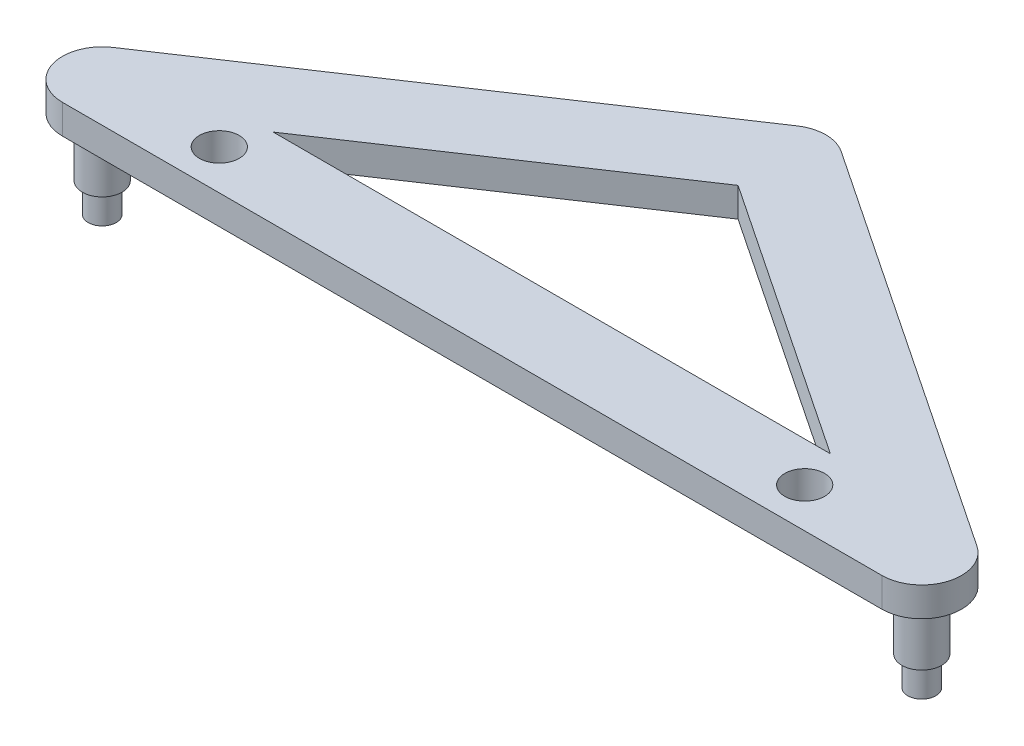
ISO-10303-21;
HEADER;
FILE_DESCRIPTION(('STEP AP214'),'2;1');
FILE_NAME('part.step','',(''),(''),'','','');
FILE_SCHEMA(('AUTOMOTIVE_DESIGN { 1 0 10303 214 1 1 1 1 }'));
ENDSEC;
DATA;
#1=APPLICATION_CONTEXT('core data for automotive mechanical design processes');
#2=APPLICATION_PROTOCOL_DEFINITION('international standard','automotive_design',2000,#1);
#3=PRODUCT_CONTEXT('',#1,'mechanical');
#4=PRODUCT('Part','Part','',(#3));
#5=PRODUCT_RELATED_PRODUCT_CATEGORY('part','',(#4));
#6=PRODUCT_DEFINITION_FORMATION('','',#4);
#7=PRODUCT_DEFINITION_CONTEXT('part definition',#1,'design');
#8=PRODUCT_DEFINITION('design','',#6,#7);
#9=PRODUCT_DEFINITION_SHAPE('','',#8);
#10=(LENGTH_UNIT() NAMED_UNIT(*) SI_UNIT(.MILLI.,.METRE.));
#11=(NAMED_UNIT(*) PLANE_ANGLE_UNIT() SI_UNIT($,.RADIAN.));
#12=(NAMED_UNIT(*) SI_UNIT($,.STERADIAN.) SOLID_ANGLE_UNIT());
#13=UNCERTAINTY_MEASURE_WITH_UNIT(LENGTH_MEASURE(1.E-05),#10,'distance_accuracy_value','');
#14=(GEOMETRIC_REPRESENTATION_CONTEXT(3) GLOBAL_UNCERTAINTY_ASSIGNED_CONTEXT((#13)) GLOBAL_UNIT_ASSIGNED_CONTEXT((#10,
#11,#12)) REPRESENTATION_CONTEXT('',''));
#15=CARTESIAN_POINT('',(0.,0.,0.));
#16=DIRECTION('',(0.,0.,1.));
#17=DIRECTION('',(1.,0.,0.));
#18=AXIS2_PLACEMENT_3D('',#15,#16,#17);
#19=CARTESIAN_POINT('',(0.,5.,0.));
#20=DIRECTION('',(0.,-1.,0.));
#21=DIRECTION('',(0.,0.,-1.));
#22=AXIS2_PLACEMENT_3D('',#19,#20,#21);
#23=CYLINDRICAL_SURFACE('',#22,1.7);
#24=CARTESIAN_POINT('',(0.,5.,0.));
#25=DIRECTION('',(0.,1.,0.));
#26=DIRECTION('',(0.,0.,1.));
#27=AXIS2_PLACEMENT_3D('',#24,#25,#26);
#28=CIRCLE('',#27,1.7);
#29=CARTESIAN_POINT('',(0.,5.,1.7));
#30=VERTEX_POINT('',#29);
#31=EDGE_CURVE('E189',#30,#30,#28,.T.);
#32=ORIENTED_EDGE('',*,*,#31,.F.);
#33=EDGE_LOOP('',(#32));
#34=FACE_BOUND('',#33,.T.);
#35=CARTESIAN_POINT('',(0.,0.,0.));
#36=DIRECTION('',(0.,1.,0.));
#37=DIRECTION('',(0.,0.,1.));
#38=AXIS2_PLACEMENT_3D('',#35,#36,#37);
#39=CIRCLE('',#38,1.7);
#40=CARTESIAN_POINT('',(0.,0.,1.7));
#41=VERTEX_POINT('',#40);
#42=EDGE_CURVE('E126',#41,#41,#39,.T.);
#43=ORIENTED_EDGE('',*,*,#42,.T.);
#44=EDGE_LOOP('',(#43));
#45=FACE_BOUND('',#44,.T.);
#46=ADVANCED_FACE('F39',(#34,#45),#23,.T.);
#47=CARTESIAN_POINT('',(0.,0.,0.));
#48=DIRECTION('',(0.,1.,0.));
#49=DIRECTION('',(0.,0.,1.));
#50=AXIS2_PLACEMENT_3D('',#47,#48,#49);
#51=PLANE('',#50);
#52=CARTESIAN_POINT('',(0.,0.,0.));
#53=DIRECTION('',(0.,-1.,0.));
#54=DIRECTION('',(0.,0.,-1.));
#55=AXIS2_PLACEMENT_3D('',#52,#53,#54);
#56=CIRCLE('',#55,1.2);
#57=CARTESIAN_POINT('',(0.,0.,-1.2));
#58=VERTEX_POINT('',#57);
#59=EDGE_CURVE('E195',#58,#58,#56,.T.);
#60=ORIENTED_EDGE('',*,*,#59,.F.);
#61=EDGE_LOOP('',(#60));
#62=FACE_BOUND('',#61,.T.);
#63=ORIENTED_EDGE('',*,*,#42,.F.);
#64=EDGE_LOOP('',(#63));
#65=FACE_BOUND('',#64,.T.);
#66=ADVANCED_FACE('F260',(#62,#65),#51,.F.);
#67=CARTESIAN_POINT('',(19.7339341229814,7.5,-29.5165681326645));
#68=DIRECTION('',(-0.55579595927859,0.,0.831318742510712));
#69=DIRECTION('',(0.831318742510712,0.,0.55579595927859));
#70=AXIS2_PLACEMENT_3D('',#67,#68,#69);
#71=PLANE('',#70);
#72=DIRECTION('',(-0.831318742510712,0.,-0.55579595927859));
#73=VECTOR('',#72,1.);
#74=CARTESIAN_POINT('',(19.7339341229814,5.,-29.5165681326645));
#75=LINE('',#74,#73);
#76=CARTESIAN_POINT('',(58.7971770564539,5.,-3.4));
#77=VERTEX_POINT('',#76);
#78=CARTESIAN_POINT('',(35.,5.,-19.3101126606006));
#79=VERTEX_POINT('',#78);
#80=EDGE_CURVE('E121',#77,#79,#75,.T.);
#81=ORIENTED_EDGE('',*,*,#80,.F.);
#82=DIRECTION('',(0.,-1.,0.));
#83=VECTOR('',#82,1.);
#84=CARTESIAN_POINT('',(58.7971770564539,7.5,-3.4));
#85=LINE('',#84,#83);
#86=CARTESIAN_POINT('',(58.7971770564539,7.5,-3.4));
#87=VERTEX_POINT('',#86);
#88=EDGE_CURVE('E117',#87,#77,#85,.T.);
#89=ORIENTED_EDGE('',*,*,#88,.F.);
#90=DIRECTION('',(-0.831318742510712,0.,-0.55579595927859));
#91=VECTOR('',#90,1.);
#92=CARTESIAN_POINT('',(19.7339341229814,7.5,-29.5165681326645));
#93=LINE('',#92,#91);
#94=CARTESIAN_POINT('',(35.,7.5,-19.3101126606006));
#95=VERTEX_POINT('',#94);
#96=EDGE_CURVE('E119',#87,#95,#93,.T.);
#97=ORIENTED_EDGE('',*,*,#96,.T.);
#98=DIRECTION('',(0.,-1.,0.));
#99=VECTOR('',#98,1.);
#100=CARTESIAN_POINT('',(35.,7.5,-19.3101126606006));
#101=LINE('',#100,#99);
#102=EDGE_CURVE('E93',#95,#79,#101,.T.);
#103=ORIENTED_EDGE('',*,*,#102,.T.);
#104=EDGE_LOOP('',(#81,#89,#97,#103));
#105=FACE_BOUND('',#104,.T.);
#106=ADVANCED_FACE('F118',(#105),#71,.T.);
#107=CARTESIAN_POINT('',(0.,7.5,-3.4));
#108=DIRECTION('',(0.,0.,-1.));
#109=DIRECTION('',(-1.,0.,0.));
#110=AXIS2_PLACEMENT_3D('',#107,#108,#109);
#111=PLANE('',#110);
#112=DIRECTION('',(1.,0.,0.));
#113=VECTOR('',#112,1.);
#114=CARTESIAN_POINT('',(0.,5.,-3.4));
#115=LINE('',#114,#113);
#116=CARTESIAN_POINT('',(11.2028229435461,5.,-3.4));
#117=VERTEX_POINT('',#116);
#118=EDGE_CURVE('E162',#117,#77,#115,.T.);
#119=ORIENTED_EDGE('',*,*,#118,.F.);
#120=DIRECTION('',(0.,-1.,0.));
#121=VECTOR('',#120,1.);
#122=CARTESIAN_POINT('',(11.2028229435461,7.5,-3.4));
#123=LINE('',#122,#121);
#124=CARTESIAN_POINT('',(11.2028229435461,7.5,-3.4));
#125=VERTEX_POINT('',#124);
#126=EDGE_CURVE('E86',#125,#117,#123,.T.);
#127=ORIENTED_EDGE('',*,*,#126,.F.);
#128=DIRECTION('',(1.,0.,0.));
#129=VECTOR('',#128,1.);
#130=CARTESIAN_POINT('',(0.,7.5,-3.4));
#131=LINE('',#130,#129);
#132=EDGE_CURVE('E130',#125,#87,#131,.T.);
#133=ORIENTED_EDGE('',*,*,#132,.T.);
#134=ORIENTED_EDGE('',*,*,#88,.T.);
#135=EDGE_LOOP('',(#119,#127,#133,#134));
#136=FACE_BOUND('',#135,.T.);
#137=ADVANCED_FACE('F133',(#136),#111,.T.);
#138=CARTESIAN_POINT('',(70.,7.5,0.));
#139=DIRECTION('',(0.,-1.,0.));
#140=DIRECTION('',(0.,0.,-1.));
#141=AXIS2_PLACEMENT_3D('',#138,#139,#140);
#142=CYLINDRICAL_SURFACE('',#141,3.4);
#143=CARTESIAN_POINT('',(70.,5.,0.));
#144=DIRECTION('',(0.,1.,0.));
#145=DIRECTION('',(0.,0.,1.));
#146=AXIS2_PLACEMENT_3D('',#143,#144,#145);
#147=CIRCLE('',#146,3.4);
#148=CARTESIAN_POINT('',(70.,5.,3.4));
#149=VERTEX_POINT('',#148);
#150=CARTESIAN_POINT('',(71.8897062615472,5.,-2.82648372453642));
#151=VERTEX_POINT('',#150);
#152=EDGE_CURVE('E145',#149,#151,#147,.T.);
#153=ORIENTED_EDGE('',*,*,#152,.T.);
#154=DIRECTION('',(0.,-1.,0.));
#155=VECTOR('',#154,1.);
#156=CARTESIAN_POINT('',(71.8897062615472,7.5,-2.82648372453642));
#157=LINE('',#156,#155);
#158=CARTESIAN_POINT('',(71.8897062615472,7.5,-2.82648372453642));
#159=VERTEX_POINT('',#158);
#160=EDGE_CURVE('E174',#159,#151,#157,.T.);
#161=ORIENTED_EDGE('',*,*,#160,.F.);
#162=CARTESIAN_POINT('',(70.,7.5,0.));
#163=DIRECTION('',(0.,1.,0.));
#164=DIRECTION('',(0.,0.,1.));
#165=AXIS2_PLACEMENT_3D('',#162,#163,#164);
#166=CIRCLE('',#165,3.4);
#167=CARTESIAN_POINT('',(70.,7.5,3.4));
#168=VERTEX_POINT('',#167);
#169=EDGE_CURVE('E172',#168,#159,#166,.T.);
#170=ORIENTED_EDGE('',*,*,#169,.F.);
#171=DIRECTION('',(0.,-1.,0.));
#172=VECTOR('',#171,1.);
#173=CARTESIAN_POINT('',(70.,7.5,3.4));
#174=LINE('',#173,#172);
#175=EDGE_CURVE('E144',#168,#149,#174,.T.);
#176=ORIENTED_EDGE('',*,*,#175,.T.);
#177=EDGE_LOOP('',(#153,#161,#170,#176));
#178=FACE_BOUND('',#177,.T.);
#179=ADVANCED_FACE('F231',(#178),#142,.T.);
#180=CARTESIAN_POINT('',(23.5133466460758,7.5,-35.1695355817373));
#181=DIRECTION('',(-0.55579595927859,0.,0.831318742510712));
#182=DIRECTION('',(0.831318742510712,0.,0.55579595927859));
#183=AXIS2_PLACEMENT_3D('',#180,#181,#182);
#184=PLANE('',#183);
#185=DIRECTION('',(-0.831318742510712,0.,-0.55579595927859));
#186=VECTOR('',#185,1.);
#187=CARTESIAN_POINT('',(23.5133466460758,5.,-35.1695355817373));
#188=LINE('',#187,#186);
#189=CARTESIAN_POINT('',(36.8897062615472,5.,-26.2264837245364));
#190=VERTEX_POINT('',#189);
#191=EDGE_CURVE('E148',#151,#190,#188,.T.);
#192=ORIENTED_EDGE('',*,*,#191,.T.);
#193=DIRECTION('',(0.,-1.,0.));
#194=VECTOR('',#193,1.);
#195=CARTESIAN_POINT('',(36.8897062615472,7.5,-26.2264837245364));
#196=LINE('',#195,#194);
#197=CARTESIAN_POINT('',(36.8897062615472,7.5,-26.2264837245364));
#198=VERTEX_POINT('',#197);
#199=EDGE_CURVE('E185',#198,#190,#196,.T.);
#200=ORIENTED_EDGE('',*,*,#199,.F.);
#201=DIRECTION('',(-0.831318742510712,0.,-0.55579595927859));
#202=VECTOR('',#201,1.);
#203=CARTESIAN_POINT('',(23.5133466460758,7.5,-35.1695355817373));
#204=LINE('',#203,#202);
#205=EDGE_CURVE('E101',#159,#198,#204,.T.);
#206=ORIENTED_EDGE('',*,*,#205,.F.);
#207=ORIENTED_EDGE('',*,*,#160,.T.);
#208=EDGE_LOOP('',(#192,#200,#206,#207));
#209=FACE_BOUND('',#208,.T.);
#210=ADVANCED_FACE('F232',(#209),#184,.F.);
#211=CARTESIAN_POINT('',(35.,7.5,-23.4));
#212=DIRECTION('',(0.,-1.,0.));
#213=DIRECTION('',(0.,0.,-1.));
#214=AXIS2_PLACEMENT_3D('',#211,#212,#213);
#215=CYLINDRICAL_SURFACE('',#214,3.4);
#216=CARTESIAN_POINT('',(35.,5.,-23.4));
#217=DIRECTION('',(0.,1.,0.));
#218=DIRECTION('',(0.,0.,1.));
#219=AXIS2_PLACEMENT_3D('',#216,#217,#218);
#220=CIRCLE('',#219,3.4);
#221=CARTESIAN_POINT('',(33.1102937384528,5.,-26.2264837245364));
#222=VERTEX_POINT('',#221);
#223=EDGE_CURVE('E151',#190,#222,#220,.T.);
#224=ORIENTED_EDGE('',*,*,#223,.T.);
#225=DIRECTION('',(0.,-1.,0.));
#226=VECTOR('',#225,1.);
#227=CARTESIAN_POINT('',(33.1102937384528,7.5,-26.2264837245364));
#228=LINE('',#227,#226);
#229=CARTESIAN_POINT('',(33.1102937384528,7.5,-26.2264837245364));
#230=VERTEX_POINT('',#229);
#231=EDGE_CURVE('E183',#230,#222,#228,.T.);
#232=ORIENTED_EDGE('',*,*,#231,.F.);
#233=CARTESIAN_POINT('',(35.,7.5,-23.4));
#234=DIRECTION('',(0.,1.,0.));
#235=DIRECTION('',(0.,0.,1.));
#236=AXIS2_PLACEMENT_3D('',#233,#234,#235);
#237=CIRCLE('',#236,3.4);
#238=EDGE_CURVE('E212',#198,#230,#237,.T.);
#239=ORIENTED_EDGE('',*,*,#238,.F.);
#240=ORIENTED_EDGE('',*,*,#199,.T.);
#241=EDGE_LOOP('',(#224,#232,#239,#240));
#242=FACE_BOUND('',#241,.T.);
#243=ADVANCED_FACE('F237',(#242),#215,.T.);
#244=CARTESIAN_POINT('',(-1.88970626154721,7.5,-2.82648372453642));
#245=DIRECTION('',(-0.55579595927859,0.,-0.831318742510712));
#246=DIRECTION('',(-0.831318742510712,0.,0.55579595927859));
#247=AXIS2_PLACEMENT_3D('',#244,#245,#246);
#248=PLANE('',#247);
#249=DIRECTION('',(0.831318742510712,0.,-0.55579595927859));
#250=VECTOR('',#249,1.);
#251=CARTESIAN_POINT('',(-1.88970626154721,5.,-2.82648372453642));
#252=LINE('',#251,#250);
#253=CARTESIAN_POINT('',(-1.88970626154721,5.,-2.82648372453642));
#254=VERTEX_POINT('',#253);
#255=EDGE_CURVE('E154',#254,#222,#252,.T.);
#256=ORIENTED_EDGE('',*,*,#255,.F.);
#257=DIRECTION('',(0.,-1.,0.));
#258=VECTOR('',#257,1.);
#259=CARTESIAN_POINT('',(-1.88970626154721,7.5,-2.82648372453642));
#260=LINE('',#259,#258);
#261=CARTESIAN_POINT('',(-1.88970626154721,7.5,-2.82648372453642));
#262=VERTEX_POINT('',#261);
#263=EDGE_CURVE('E181',#262,#254,#260,.T.);
#264=ORIENTED_EDGE('',*,*,#263,.F.);
#265=DIRECTION('',(0.831318742510712,0.,-0.55579595927859));
#266=VECTOR('',#265,1.);
#267=CARTESIAN_POINT('',(-1.88970626154721,7.5,-2.82648372453642));
#268=LINE('',#267,#266);
#269=EDGE_CURVE('E214',#262,#230,#268,.T.);
#270=ORIENTED_EDGE('',*,*,#269,.T.);
#271=ORIENTED_EDGE('',*,*,#231,.T.);
#272=EDGE_LOOP('',(#256,#264,#270,#271));
#273=FACE_BOUND('',#272,.T.);
#274=ADVANCED_FACE('F244',(#273),#248,.T.);
#275=CARTESIAN_POINT('',(0.,7.5,0.));
#276=DIRECTION('',(0.,-1.,0.));
#277=DIRECTION('',(0.,0.,-1.));
#278=AXIS2_PLACEMENT_3D('',#275,#276,#277);
#279=CYLINDRICAL_SURFACE('',#278,3.4);
#280=CARTESIAN_POINT('',(0.,5.,0.));
#281=DIRECTION('',(0.,1.,0.));
#282=DIRECTION('',(0.,0.,1.));
#283=AXIS2_PLACEMENT_3D('',#280,#281,#282);
#284=CIRCLE('',#283,3.4);
#285=CARTESIAN_POINT('',(0.,5.,3.4));
#286=VERTEX_POINT('',#285);
#287=EDGE_CURVE('E157',#254,#286,#284,.T.);
#288=ORIENTED_EDGE('',*,*,#287,.T.);
#289=DIRECTION('',(0.,-1.,0.));
#290=VECTOR('',#289,1.);
#291=CARTESIAN_POINT('',(0.,7.5,3.4));
#292=LINE('',#291,#290);
#293=CARTESIAN_POINT('',(0.,7.5,3.4));
#294=VERTEX_POINT('',#293);
#295=EDGE_CURVE('E178',#294,#286,#292,.T.);
#296=ORIENTED_EDGE('',*,*,#295,.F.);
#297=CARTESIAN_POINT('',(0.,7.5,0.));
#298=DIRECTION('',(0.,1.,0.));
#299=DIRECTION('',(0.,0.,1.));
#300=AXIS2_PLACEMENT_3D('',#297,#298,#299);
#301=CIRCLE('',#300,3.4);
#302=EDGE_CURVE('E217',#262,#294,#301,.T.);
#303=ORIENTED_EDGE('',*,*,#302,.F.);
#304=ORIENTED_EDGE('',*,*,#263,.T.);
#305=EDGE_LOOP('',(#288,#296,#303,#304));
#306=FACE_BOUND('',#305,.T.);
#307=ADVANCED_FACE('F246',(#306),#279,.T.);
#308=CARTESIAN_POINT('',(10.,7.5,0.));
#309=DIRECTION('',(0.,-1.,0.));
#310=DIRECTION('',(0.,0.,-1.));
#311=AXIS2_PLACEMENT_3D('',#308,#309,#310);
#312=CYLINDRICAL_SURFACE('',#311,1.7);
#313=CARTESIAN_POINT('',(10.,7.5,0.));
#314=DIRECTION('',(0.,1.,0.));
#315=DIRECTION('',(0.,0.,1.));
#316=AXIS2_PLACEMENT_3D('',#313,#314,#315);
#317=CIRCLE('',#316,1.7);
#318=CARTESIAN_POINT('',(10.,7.5,1.7));
#319=VERTEX_POINT('',#318);
#320=EDGE_CURVE('E135',#319,#319,#317,.T.);
#321=ORIENTED_EDGE('',*,*,#320,.T.);
#322=EDGE_LOOP('',(#321));
#323=FACE_BOUND('',#322,.T.);
#324=CARTESIAN_POINT('',(10.,5.,0.));
#325=DIRECTION('',(0.,1.,0.));
#326=DIRECTION('',(0.,0.,1.));
#327=AXIS2_PLACEMENT_3D('',#324,#325,#326);
#328=CIRCLE('',#327,1.7);
#329=CARTESIAN_POINT('',(10.,5.,1.7));
#330=VERTEX_POINT('',#329);
#331=EDGE_CURVE('E166',#330,#330,#328,.T.);
#332=ORIENTED_EDGE('',*,*,#331,.F.);
#333=EDGE_LOOP('',(#332));
#334=FACE_BOUND('',#333,.T.);
#335=ADVANCED_FACE('F248',(#323,#334),#312,.F.);
#336=CARTESIAN_POINT('',(1.8897062615472,7.5,2.82648372453642));
#337=DIRECTION('',(-0.55579595927859,0.,-0.831318742510712));
#338=DIRECTION('',(-0.831318742510712,0.,0.55579595927859));
#339=AXIS2_PLACEMENT_3D('',#336,#337,#338);
#340=PLANE('',#339);
#341=DIRECTION('',(0.831318742510712,0.,-0.55579595927859));
#342=VECTOR('',#341,1.);
#343=CARTESIAN_POINT('',(1.8897062615472,5.,2.82648372453642));
#344=LINE('',#343,#342);
#345=EDGE_CURVE('E164',#117,#79,#344,.T.);
#346=ORIENTED_EDGE('',*,*,#345,.T.);
#347=ORIENTED_EDGE('',*,*,#102,.F.);
#348=DIRECTION('',(0.831318742510712,0.,-0.55579595927859));
#349=VECTOR('',#348,1.);
#350=CARTESIAN_POINT('',(1.8897062615472,7.5,2.82648372453642));
#351=LINE('',#350,#349);
#352=EDGE_CURVE('E55',#125,#95,#351,.T.);
#353=ORIENTED_EDGE('',*,*,#352,.F.);
#354=ORIENTED_EDGE('',*,*,#126,.T.);
#355=EDGE_LOOP('',(#346,#347,#353,#354));
#356=FACE_BOUND('',#355,.T.);
#357=ADVANCED_FACE('F254',(#356),#340,.F.);
#358=CARTESIAN_POINT('',(0.,7.5,3.4));
#359=DIRECTION('',(0.,0.,-1.));
#360=DIRECTION('',(-1.,0.,0.));
#361=AXIS2_PLACEMENT_3D('',#358,#359,#360);
#362=PLANE('',#361);
#363=DIRECTION('',(1.,0.,0.));
#364=VECTOR('',#363,1.);
#365=CARTESIAN_POINT('',(0.,5.,3.4));
#366=LINE('',#365,#364);
#367=EDGE_CURVE('E159',#286,#149,#366,.T.);
#368=ORIENTED_EDGE('',*,*,#367,.T.);
#369=ORIENTED_EDGE('',*,*,#175,.F.);
#370=DIRECTION('',(1.,0.,0.));
#371=VECTOR('',#370,1.);
#372=CARTESIAN_POINT('',(0.,7.5,3.4));
#373=LINE('',#372,#371);
#374=EDGE_CURVE('E131',#294,#168,#373,.T.);
#375=ORIENTED_EDGE('',*,*,#374,.F.);
#376=ORIENTED_EDGE('',*,*,#295,.T.);
#377=EDGE_LOOP('',(#368,#369,#375,#376));
#378=FACE_BOUND('',#377,.T.);
#379=ADVANCED_FACE('F227',(#378),#362,.F.);
#380=CARTESIAN_POINT('',(60.,7.5,0.));
#381=DIRECTION('',(0.,-1.,0.));
#382=DIRECTION('',(0.,0.,-1.));
#383=AXIS2_PLACEMENT_3D('',#380,#381,#382);
#384=CYLINDRICAL_SURFACE('',#383,1.7);
#385=CARTESIAN_POINT('',(60.,7.5,0.));
#386=DIRECTION('',(0.,1.,0.));
#387=DIRECTION('',(0.,0.,1.));
#388=AXIS2_PLACEMENT_3D('',#385,#386,#387);
#389=CIRCLE('',#388,1.7);
#390=CARTESIAN_POINT('',(60.,7.5,1.7));
#391=VERTEX_POINT('',#390);
#392=EDGE_CURVE('E141',#391,#391,#389,.F.);
#393=ORIENTED_EDGE('',*,*,#392,.F.);
#394=EDGE_LOOP('',(#393));
#395=FACE_BOUND('',#394,.T.);
#396=CARTESIAN_POINT('',(60.,5.,0.));
#397=DIRECTION('',(0.,1.,0.));
#398=DIRECTION('',(0.,0.,1.));
#399=AXIS2_PLACEMENT_3D('',#396,#397,#398);
#400=CIRCLE('',#399,1.7);
#401=CARTESIAN_POINT('',(60.,5.,1.7));
#402=VERTEX_POINT('',#401);
#403=EDGE_CURVE('E169',#402,#402,#400,.F.);
#404=ORIENTED_EDGE('',*,*,#403,.T.);
#405=EDGE_LOOP('',(#404));
#406=FACE_BOUND('',#405,.T.);
#407=ADVANCED_FACE('F284',(#395,#406),#384,.F.);
#408=CARTESIAN_POINT('',(0.,7.5,0.));
#409=DIRECTION('',(0.,1.,0.));
#410=DIRECTION('',(0.,0.,1.));
#411=AXIS2_PLACEMENT_3D('',#408,#409,#410);
#412=PLANE('',#411);
#413=ORIENTED_EDGE('',*,*,#169,.T.);
#414=ORIENTED_EDGE('',*,*,#205,.T.);
#415=ORIENTED_EDGE('',*,*,#238,.T.);
#416=ORIENTED_EDGE('',*,*,#269,.F.);
#417=ORIENTED_EDGE('',*,*,#302,.T.);
#418=ORIENTED_EDGE('',*,*,#374,.T.);
#419=EDGE_LOOP('',(#413,#414,#415,#416,#417,#418));
#420=FACE_BOUND('',#419,.T.);
#421=ORIENTED_EDGE('',*,*,#96,.F.);
#422=ORIENTED_EDGE('',*,*,#132,.F.);
#423=ORIENTED_EDGE('',*,*,#352,.T.);
#424=EDGE_LOOP('',(#421,#422,#423));
#425=FACE_BOUND('',#424,.T.);
#426=ORIENTED_EDGE('',*,*,#320,.F.);
#427=EDGE_LOOP('',(#426));
#428=FACE_BOUND('',#427,.T.);
#429=ORIENTED_EDGE('',*,*,#392,.T.);
#430=EDGE_LOOP('',(#429));
#431=FACE_BOUND('',#430,.T.);
#432=ADVANCED_FACE('F128',(#420,#425,#428,#431),#412,.T.);
#433=CARTESIAN_POINT('',(0.,5.,0.));
#434=DIRECTION('',(0.,1.,0.));
#435=DIRECTION('',(0.,0.,1.));
#436=AXIS2_PLACEMENT_3D('',#433,#434,#435);
#437=PLANE('',#436);
#438=CARTESIAN_POINT('',(35.,5.,-23.4));
#439=DIRECTION('',(0.,1.,0.));
#440=DIRECTION('',(0.,0.,1.));
#441=AXIS2_PLACEMENT_3D('',#438,#439,#440);
#442=CIRCLE('',#441,1.7);
#443=CARTESIAN_POINT('',(35.,5.,-21.7));
#444=VERTEX_POINT('',#443);
#445=EDGE_CURVE('E11',#444,#444,#442,.F.);
#446=ORIENTED_EDGE('',*,*,#445,.F.);
#447=EDGE_LOOP('',(#446));
#448=FACE_BOUND('',#447,.T.);
#449=CARTESIAN_POINT('',(70.,5.,0.));
#450=DIRECTION('',(0.,1.,0.));
#451=DIRECTION('',(0.,0.,1.));
#452=AXIS2_PLACEMENT_3D('',#449,#450,#451);
#453=CIRCLE('',#452,1.7);
#454=CARTESIAN_POINT('',(70.,5.,1.7));
#455=VERTEX_POINT('',#454);
#456=EDGE_CURVE('E192',#455,#455,#453,.F.);
#457=ORIENTED_EDGE('',*,*,#456,.F.);
#458=EDGE_LOOP('',(#457));
#459=FACE_BOUND('',#458,.T.);
#460=ORIENTED_EDGE('',*,*,#31,.T.);
#461=EDGE_LOOP('',(#460));
#462=FACE_BOUND('',#461,.T.);
#463=ORIENTED_EDGE('',*,*,#152,.F.);
#464=ORIENTED_EDGE('',*,*,#367,.F.);
#465=ORIENTED_EDGE('',*,*,#287,.F.);
#466=ORIENTED_EDGE('',*,*,#255,.T.);
#467=ORIENTED_EDGE('',*,*,#223,.F.);
#468=ORIENTED_EDGE('',*,*,#191,.F.);
#469=EDGE_LOOP('',(#463,#464,#465,#466,#467,#468));
#470=FACE_BOUND('',#469,.T.);
#471=ORIENTED_EDGE('',*,*,#80,.T.);
#472=ORIENTED_EDGE('',*,*,#345,.F.);
#473=ORIENTED_EDGE('',*,*,#118,.T.);
#474=EDGE_LOOP('',(#471,#472,#473));
#475=FACE_BOUND('',#474,.T.);
#476=ORIENTED_EDGE('',*,*,#331,.T.);
#477=EDGE_LOOP('',(#476));
#478=FACE_BOUND('',#477,.T.);
#479=ORIENTED_EDGE('',*,*,#403,.F.);
#480=EDGE_LOOP('',(#479));
#481=FACE_BOUND('',#480,.T.);
#482=ADVANCED_FACE('F239',(#448,#459,#462,#470,#475,#478,#481),#437,.F.);
#483=CARTESIAN_POINT('',(70.,5.,0.));
#484=DIRECTION('',(0.,-1.,0.));
#485=DIRECTION('',(0.,0.,-1.));
#486=AXIS2_PLACEMENT_3D('',#483,#484,#485);
#487=CYLINDRICAL_SURFACE('',#486,1.7);
#488=ORIENTED_EDGE('',*,*,#456,.T.);
#489=EDGE_LOOP('',(#488));
#490=FACE_BOUND('',#489,.T.);
#491=CARTESIAN_POINT('',(70.,0.,0.));
#492=DIRECTION('',(0.,1.,0.));
#493=DIRECTION('',(0.,0.,1.));
#494=AXIS2_PLACEMENT_3D('',#491,#492,#493);
#495=CIRCLE('',#494,1.7);
#496=CARTESIAN_POINT('',(70.,0.,1.7));
#497=VERTEX_POINT('',#496);
#498=EDGE_CURVE('E149',#497,#497,#495,.T.);
#499=ORIENTED_EDGE('',*,*,#498,.T.);
#500=EDGE_LOOP('',(#499));
#501=FACE_BOUND('',#500,.T.);
#502=ADVANCED_FACE('F273',(#490,#501),#487,.T.);
#503=CARTESIAN_POINT('',(70.,0.,0.));
#504=DIRECTION('',(0.,1.,0.));
#505=DIRECTION('',(0.,0.,1.));
#506=AXIS2_PLACEMENT_3D('',#503,#504,#505);
#507=PLANE('',#506);
#508=CARTESIAN_POINT('',(70.,0.,0.));
#509=DIRECTION('',(0.,-1.,0.));
#510=DIRECTION('',(0.,0.,-1.));
#511=AXIS2_PLACEMENT_3D('',#508,#509,#510);
#512=CIRCLE('',#511,1.2);
#513=CARTESIAN_POINT('',(70.,0.,-1.2));
#514=VERTEX_POINT('',#513);
#515=EDGE_CURVE('E47',#514,#514,#512,.T.);
#516=ORIENTED_EDGE('',*,*,#515,.F.);
#517=EDGE_LOOP('',(#516));
#518=FACE_BOUND('',#517,.T.);
#519=ORIENTED_EDGE('',*,*,#498,.F.);
#520=EDGE_LOOP('',(#519));
#521=FACE_BOUND('',#520,.T.);
#522=ADVANCED_FACE('F281',(#518,#521),#507,.F.);
#523=CARTESIAN_POINT('',(0.,-2.5,0.));
#524=DIRECTION('',(0.,1.,0.));
#525=DIRECTION('',(0.,0.,1.));
#526=AXIS2_PLACEMENT_3D('',#523,#524,#525);
#527=CYLINDRICAL_SURFACE('',#526,1.2);
#528=CARTESIAN_POINT('',(0.,-2.5,0.));
#529=DIRECTION('',(0.,-1.,0.));
#530=DIRECTION('',(0.,0.,-1.));
#531=AXIS2_PLACEMENT_3D('',#528,#529,#530);
#532=CIRCLE('',#531,1.2);
#533=CARTESIAN_POINT('',(0.,-2.5,-1.2));
#534=VERTEX_POINT('',#533);
#535=EDGE_CURVE('E206',#534,#534,#532,.T.);
#536=ORIENTED_EDGE('',*,*,#535,.F.);
#537=EDGE_LOOP('',(#536));
#538=FACE_BOUND('',#537,.T.);
#539=ORIENTED_EDGE('',*,*,#59,.T.);
#540=EDGE_LOOP('',(#539));
#541=FACE_BOUND('',#540,.T.);
#542=ADVANCED_FACE('F330',(#538,#541),#527,.T.);
#543=CARTESIAN_POINT('',(0.,-2.5,0.));
#544=DIRECTION('',(0.,-1.,0.));
#545=DIRECTION('',(0.,0.,-1.));
#546=AXIS2_PLACEMENT_3D('',#543,#544,#545);
#547=PLANE('',#546);
#548=ORIENTED_EDGE('',*,*,#535,.T.);
#549=EDGE_LOOP('',(#548));
#550=FACE_BOUND('',#549,.T.);
#551=ADVANCED_FACE('F338',(#550),#547,.T.);
#552=CARTESIAN_POINT('',(70.,-2.5,0.));
#553=DIRECTION('',(0.,1.,0.));
#554=DIRECTION('',(0.,0.,1.));
#555=AXIS2_PLACEMENT_3D('',#552,#553,#554);
#556=CYLINDRICAL_SURFACE('',#555,1.2);
#557=CARTESIAN_POINT('',(70.,-2.5,0.));
#558=DIRECTION('',(0.,-1.,0.));
#559=DIRECTION('',(0.,0.,-1.));
#560=AXIS2_PLACEMENT_3D('',#557,#558,#559);
#561=CIRCLE('',#560,1.2);
#562=CARTESIAN_POINT('',(70.,-2.5,-1.2));
#563=VERTEX_POINT('',#562);
#564=EDGE_CURVE('E391',#563,#563,#561,.T.);
#565=ORIENTED_EDGE('',*,*,#564,.F.);
#566=EDGE_LOOP('',(#565));
#567=FACE_BOUND('',#566,.T.);
#568=ORIENTED_EDGE('',*,*,#515,.T.);
#569=EDGE_LOOP('',(#568));
#570=FACE_BOUND('',#569,.T.);
#571=ADVANCED_FACE('F347',(#567,#570),#556,.T.);
#572=CARTESIAN_POINT('',(70.,-2.5,0.));
#573=DIRECTION('',(0.,-1.,0.));
#574=DIRECTION('',(0.,0.,-1.));
#575=AXIS2_PLACEMENT_3D('',#572,#573,#574);
#576=PLANE('',#575);
#577=ORIENTED_EDGE('',*,*,#564,.T.);
#578=EDGE_LOOP('',(#577));
#579=FACE_BOUND('',#578,.T.);
#580=ADVANCED_FACE('F355',(#579),#576,.T.);
#581=CARTESIAN_POINT('',(35.,0.,-23.4));
#582=DIRECTION('',(0.,1.,0.));
#583=DIRECTION('',(0.,0.,1.));
#584=AXIS2_PLACEMENT_3D('',#581,#582,#583);
#585=CYLINDRICAL_SURFACE('',#584,1.7);
#586=CARTESIAN_POINT('',(35.,0.,-23.4));
#587=DIRECTION('',(0.,-1.,0.));
#588=DIRECTION('',(0.,0.,-1.));
#589=AXIS2_PLACEMENT_3D('',#586,#587,#588);
#590=CIRCLE('',#589,1.7);
#591=CARTESIAN_POINT('',(35.,0.,-25.1));
#592=VERTEX_POINT('',#591);
#593=EDGE_CURVE('E390',#592,#592,#590,.T.);
#594=ORIENTED_EDGE('',*,*,#593,.F.);
#595=EDGE_LOOP('',(#594));
#596=FACE_BOUND('',#595,.T.);
#597=ORIENTED_EDGE('',*,*,#445,.T.);
#598=EDGE_LOOP('',(#597));
#599=FACE_BOUND('',#598,.T.);
#600=ADVANCED_FACE('F363',(#596,#599),#585,.T.);
#601=CARTESIAN_POINT('',(35.,0.,-23.4));
#602=DIRECTION('',(0.,-1.,0.));
#603=DIRECTION('',(0.,0.,-1.));
#604=AXIS2_PLACEMENT_3D('',#601,#602,#603);
#605=PLANE('',#604);
#606=ORIENTED_EDGE('',*,*,#593,.T.);
#607=EDGE_LOOP('',(#606));
#608=FACE_BOUND('',#607,.T.);
#609=ADVANCED_FACE('F375',(#608),#605,.T.);
#610=CLOSED_SHELL('',(#46,#66,#106,#137,#179,#210,#243,#274,#307,#335,#357,#379,#407,#432,#482,
#502,#522,#542,#551,#571,#580,#600,#609));
#611=MANIFOLD_SOLID_BREP('B2',#610);
#612=ADVANCED_BREP_SHAPE_REPRESENTATION('',(#18,#611),#14);
#613=SHAPE_DEFINITION_REPRESENTATION(#9,#612);
ENDSEC;
END-ISO-10303-21;
